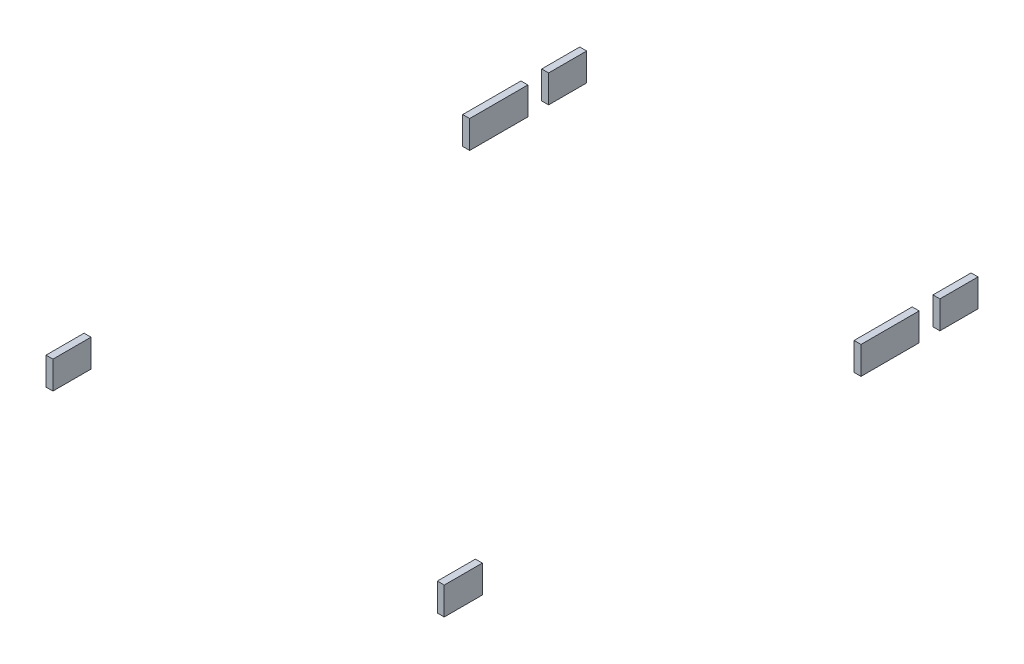
ISO-10303-21;
HEADER;
FILE_DESCRIPTION(('STEP AP214'),'2;1');
FILE_NAME('part.step','',(''),(''),'','','');
FILE_SCHEMA(('AUTOMOTIVE_DESIGN { 1 0 10303 214 1 1 1 1 }'));
ENDSEC;
DATA;
#1=APPLICATION_CONTEXT('core data for automotive mechanical design processes');
#2=APPLICATION_PROTOCOL_DEFINITION('international standard','automotive_design',2000,#1);
#3=PRODUCT_CONTEXT('',#1,'mechanical');
#4=PRODUCT('Part','Part','',(#3));
#5=PRODUCT_RELATED_PRODUCT_CATEGORY('part','',(#4));
#6=PRODUCT_DEFINITION_FORMATION('','',#4);
#7=PRODUCT_DEFINITION_CONTEXT('part definition',#1,'design');
#8=PRODUCT_DEFINITION('design','',#6,#7);
#9=PRODUCT_DEFINITION_SHAPE('','',#8);
#10=(LENGTH_UNIT() NAMED_UNIT(*) SI_UNIT(.MILLI.,.METRE.));
#11=(NAMED_UNIT(*) PLANE_ANGLE_UNIT() SI_UNIT($,.RADIAN.));
#12=(NAMED_UNIT(*) SI_UNIT($,.STERADIAN.) SOLID_ANGLE_UNIT());
#13=UNCERTAINTY_MEASURE_WITH_UNIT(LENGTH_MEASURE(1.E-05),#10,'distance_accuracy_value','');
#14=(GEOMETRIC_REPRESENTATION_CONTEXT(3) GLOBAL_UNCERTAINTY_ASSIGNED_CONTEXT((#13)) GLOBAL_UNIT_ASSIGNED_CONTEXT((#10,
#11,#12)) REPRESENTATION_CONTEXT('',''));
#15=CARTESIAN_POINT('',(0.,0.,0.));
#16=DIRECTION('',(0.,0.,1.));
#17=DIRECTION('',(1.,0.,0.));
#18=AXIS2_PLACEMENT_3D('',#15,#16,#17);
#19=CARTESIAN_POINT('',(-287.55,-400.,600.));
#20=DIRECTION('',(0.,0.,1.));
#21=DIRECTION('',(1.,0.,0.));
#22=AXIS2_PLACEMENT_3D('',#19,#20,#21);
#23=PLANE('',#22);
#24=DIRECTION('',(1.,0.,0.));
#25=VECTOR('',#24,1.);
#26=CARTESIAN_POINT('',(-287.55,-400.,600.));
#27=LINE('',#26,#25);
#28=CARTESIAN_POINT('',(-287.55,-400.,600.));
#29=VERTEX_POINT('',#28);
#30=CARTESIAN_POINT('',(-277.55,-400.,600.));
#31=VERTEX_POINT('',#30);
#32=EDGE_CURVE('P0_E10',#29,#31,#27,.T.);
#33=ORIENTED_EDGE('',*,*,#32,.T.);
#34=DIRECTION('',(0.,-1.,0.));
#35=VECTOR('',#34,1.);
#36=CARTESIAN_POINT('',(-277.55,-400.,600.));
#37=LINE('',#36,#35);
#38=CARTESIAN_POINT('',(-277.55,-440.,600.));
#39=VERTEX_POINT('',#38);
#40=EDGE_CURVE('P0_E25',#31,#39,#37,.T.);
#41=ORIENTED_EDGE('',*,*,#40,.T.);
#42=DIRECTION('',(1.,0.,0.));
#43=VECTOR('',#42,1.);
#44=CARTESIAN_POINT('',(-287.55,-440.,600.));
#45=LINE('',#44,#43);
#46=CARTESIAN_POINT('',(-287.55,-440.,600.));
#47=VERTEX_POINT('',#46);
#48=EDGE_CURVE('P0_E76',#47,#39,#45,.T.);
#49=ORIENTED_EDGE('',*,*,#48,.F.);
#50=DIRECTION('',(0.,-1.,0.));
#51=VECTOR('',#50,1.);
#52=CARTESIAN_POINT('',(-287.55,-400.,600.));
#53=LINE('',#52,#51);
#54=EDGE_CURVE('P0_E73',#29,#47,#53,.T.);
#55=ORIENTED_EDGE('',*,*,#54,.F.);
#56=EDGE_LOOP('',(#33,#41,#49,#55));
#57=FACE_BOUND('',#56,.T.);
#58=ADVANCED_FACE('P0_F15',(#57),#23,.F.);
#59=CARTESIAN_POINT('',(-277.55,-400.,600.));
#60=DIRECTION('',(-1.,0.,0.));
#61=DIRECTION('',(0.,0.,1.));
#62=AXIS2_PLACEMENT_3D('',#59,#60,#61);
#63=PLANE('',#62);
#64=DIRECTION('',(0.,0.,1.));
#65=VECTOR('',#64,1.);
#66=CARTESIAN_POINT('',(-277.55,-400.,600.));
#67=LINE('',#66,#65);
#68=CARTESIAN_POINT('',(-277.55,-400.,655.));
#69=VERTEX_POINT('',#68);
#70=EDGE_CURVE('P0_E81',#31,#69,#67,.T.);
#71=ORIENTED_EDGE('',*,*,#70,.T.);
#72=DIRECTION('',(0.,-1.,0.));
#73=VECTOR('',#72,1.);
#74=CARTESIAN_POINT('',(-277.55,-400.,655.));
#75=LINE('',#74,#73);
#76=CARTESIAN_POINT('',(-277.55,-440.,655.));
#77=VERTEX_POINT('',#76);
#78=EDGE_CURVE('P0_E83',#69,#77,#75,.T.);
#79=ORIENTED_EDGE('',*,*,#78,.T.);
#80=DIRECTION('',(0.,0.,1.));
#81=VECTOR('',#80,1.);
#82=CARTESIAN_POINT('',(-277.55,-440.,600.));
#83=LINE('',#82,#81);
#84=EDGE_CURVE('P0_E60',#39,#77,#83,.T.);
#85=ORIENTED_EDGE('',*,*,#84,.F.);
#86=ORIENTED_EDGE('',*,*,#40,.F.);
#87=EDGE_LOOP('',(#71,#79,#85,#86));
#88=FACE_BOUND('',#87,.T.);
#89=ADVANCED_FACE('P0_F86',(#88),#63,.F.);
#90=CARTESIAN_POINT('',(-277.55,-400.,655.));
#91=DIRECTION('',(0.,0.,-1.));
#92=DIRECTION('',(-1.,0.,0.));
#93=AXIS2_PLACEMENT_3D('',#90,#91,#92);
#94=PLANE('',#93);
#95=DIRECTION('',(-1.,0.,0.));
#96=VECTOR('',#95,1.);
#97=CARTESIAN_POINT('',(-277.55,-400.,655.));
#98=LINE('',#97,#96);
#99=CARTESIAN_POINT('',(-287.55,-400.,655.));
#100=VERTEX_POINT('',#99);
#101=EDGE_CURVE('P0_E66',#69,#100,#98,.T.);
#102=ORIENTED_EDGE('',*,*,#101,.T.);
#103=DIRECTION('',(0.,-1.,0.));
#104=VECTOR('',#103,1.);
#105=CARTESIAN_POINT('',(-287.55,-400.,655.));
#106=LINE('',#105,#104);
#107=CARTESIAN_POINT('',(-287.55,-440.,655.));
#108=VERTEX_POINT('',#107);
#109=EDGE_CURVE('P0_E53',#100,#108,#106,.T.);
#110=ORIENTED_EDGE('',*,*,#109,.T.);
#111=DIRECTION('',(-1.,0.,0.));
#112=VECTOR('',#111,1.);
#113=CARTESIAN_POINT('',(-277.55,-440.,655.));
#114=LINE('',#113,#112);
#115=EDGE_CURVE('P0_E59',#77,#108,#114,.T.);
#116=ORIENTED_EDGE('',*,*,#115,.F.);
#117=ORIENTED_EDGE('',*,*,#78,.F.);
#118=EDGE_LOOP('',(#102,#110,#116,#117));
#119=FACE_BOUND('',#118,.T.);
#120=ADVANCED_FACE('P0_F64',(#119),#94,.F.);
#121=CARTESIAN_POINT('',(-287.55,-400.,655.));
#122=DIRECTION('',(1.,0.,0.));
#123=DIRECTION('',(0.,0.,-1.));
#124=AXIS2_PLACEMENT_3D('',#121,#122,#123);
#125=PLANE('',#124);
#126=DIRECTION('',(0.,0.,-1.));
#127=VECTOR('',#126,1.);
#128=CARTESIAN_POINT('',(-287.55,-400.,655.));
#129=LINE('',#128,#127);
#130=EDGE_CURVE('P0_E68',#100,#29,#129,.T.);
#131=ORIENTED_EDGE('',*,*,#130,.T.);
#132=ORIENTED_EDGE('',*,*,#54,.T.);
#133=DIRECTION('',(0.,0.,-1.));
#134=VECTOR('',#133,1.);
#135=CARTESIAN_POINT('',(-287.55,-440.,655.));
#136=LINE('',#135,#134);
#137=EDGE_CURVE('P0_E19',#108,#47,#136,.T.);
#138=ORIENTED_EDGE('',*,*,#137,.F.);
#139=ORIENTED_EDGE('',*,*,#109,.F.);
#140=EDGE_LOOP('',(#131,#132,#138,#139));
#141=FACE_BOUND('',#140,.T.);
#142=ADVANCED_FACE('P0_F71',(#141),#125,.F.);
#143=CARTESIAN_POINT('',(1.085961E-11,-400.,876.96888276263));
#144=DIRECTION('',(0.,1.,0.));
#145=DIRECTION('',(0.,0.,1.));
#146=AXIS2_PLACEMENT_3D('',#143,#144,#145);
#147=PLANE('',#146);
#148=ORIENTED_EDGE('',*,*,#130,.F.);
#149=ORIENTED_EDGE('',*,*,#101,.F.);
#150=ORIENTED_EDGE('',*,*,#70,.F.);
#151=ORIENTED_EDGE('',*,*,#32,.F.);
#152=EDGE_LOOP('',(#148,#149,#150,#151));
#153=FACE_BOUND('',#152,.T.);
#154=ADVANCED_FACE('P0_F89',(#153),#147,.T.);
#155=CARTESIAN_POINT('',(1.086361E-11,-440.,876.96888276263));
#156=DIRECTION('',(0.,1.,0.));
#157=DIRECTION('',(0.,0.,1.));
#158=AXIS2_PLACEMENT_3D('',#155,#156,#157);
#159=PLANE('',#158);
#160=ORIENTED_EDGE('',*,*,#48,.T.);
#161=ORIENTED_EDGE('',*,*,#84,.T.);
#162=ORIENTED_EDGE('',*,*,#115,.T.);
#163=ORIENTED_EDGE('',*,*,#137,.T.);
#164=EDGE_LOOP('',(#160,#161,#162,#163));
#165=FACE_BOUND('',#164,.T.);
#166=ADVANCED_FACE('P0_F17',(#165),#159,.F.);
#167=CLOSED_SHELL('',(#58,#89,#120,#142,#154,#166));
#168=MANIFOLD_SOLID_BREP('P0_B1',#167);
#169=CARTESIAN_POINT('',(287.55,-400.,1370.8));
#170=DIRECTION('',(0.,0.,-1.));
#171=DIRECTION('',(-1.,0.,0.));
#172=AXIS2_PLACEMENT_3D('',#169,#170,#171);
#173=PLANE('',#172);
#174=DIRECTION('',(-1.,0.,0.));
#175=VECTOR('',#174,1.);
#176=CARTESIAN_POINT('',(287.55,-400.,1370.8));
#177=LINE('',#176,#175);
#178=CARTESIAN_POINT('',(287.55,-400.,1370.8));
#179=VERTEX_POINT('',#178);
#180=CARTESIAN_POINT('',(277.55,-400.,1370.8));
#181=VERTEX_POINT('',#180);
#182=EDGE_CURVE('P1_E11',#179,#181,#177,.T.);
#183=ORIENTED_EDGE('',*,*,#182,.T.);
#184=DIRECTION('',(0.,-1.,0.));
#185=VECTOR('',#184,1.);
#186=CARTESIAN_POINT('',(277.55,-400.,1370.8));
#187=LINE('',#186,#185);
#188=CARTESIAN_POINT('',(277.55,-440.,1370.8));
#189=VERTEX_POINT('',#188);
#190=EDGE_CURVE('P1_E26',#181,#189,#187,.T.);
#191=ORIENTED_EDGE('',*,*,#190,.T.);
#192=DIRECTION('',(-1.,0.,0.));
#193=VECTOR('',#192,1.);
#194=CARTESIAN_POINT('',(287.55,-440.,1370.8));
#195=LINE('',#194,#193);
#196=CARTESIAN_POINT('',(287.55,-440.,1370.8));
#197=VERTEX_POINT('',#196);
#198=EDGE_CURVE('P1_E77',#197,#189,#195,.T.);
#199=ORIENTED_EDGE('',*,*,#198,.F.);
#200=DIRECTION('',(0.,-1.,0.));
#201=VECTOR('',#200,1.);
#202=CARTESIAN_POINT('',(287.55,-400.,1370.8));
#203=LINE('',#202,#201);
#204=EDGE_CURVE('P1_E74',#179,#197,#203,.T.);
#205=ORIENTED_EDGE('',*,*,#204,.F.);
#206=EDGE_LOOP('',(#183,#191,#199,#205));
#207=FACE_BOUND('',#206,.T.);
#208=ADVANCED_FACE('P1_F16',(#207),#173,.F.);
#209=CARTESIAN_POINT('',(277.55,-400.,1370.8));
#210=DIRECTION('',(1.,0.,0.));
#211=DIRECTION('',(0.,0.,-1.));
#212=AXIS2_PLACEMENT_3D('',#209,#210,#211);
#213=PLANE('',#212);
#214=DIRECTION('',(0.,0.,-1.));
#215=VECTOR('',#214,1.);
#216=CARTESIAN_POINT('',(277.55,-400.,1370.8));
#217=LINE('',#216,#215);
#218=CARTESIAN_POINT('',(277.55,-400.,1315.8));
#219=VERTEX_POINT('',#218);
#220=EDGE_CURVE('P1_E82',#181,#219,#217,.T.);
#221=ORIENTED_EDGE('',*,*,#220,.T.);
#222=DIRECTION('',(0.,-1.,0.));
#223=VECTOR('',#222,1.);
#224=CARTESIAN_POINT('',(277.55,-400.,1315.8));
#225=LINE('',#224,#223);
#226=CARTESIAN_POINT('',(277.55,-440.,1315.8));
#227=VERTEX_POINT('',#226);
#228=EDGE_CURVE('P1_E84',#219,#227,#225,.T.);
#229=ORIENTED_EDGE('',*,*,#228,.T.);
#230=DIRECTION('',(0.,0.,-1.));
#231=VECTOR('',#230,1.);
#232=CARTESIAN_POINT('',(277.55,-440.,1370.8));
#233=LINE('',#232,#231);
#234=EDGE_CURVE('P1_E61',#189,#227,#233,.T.);
#235=ORIENTED_EDGE('',*,*,#234,.F.);
#236=ORIENTED_EDGE('',*,*,#190,.F.);
#237=EDGE_LOOP('',(#221,#229,#235,#236));
#238=FACE_BOUND('',#237,.T.);
#239=ADVANCED_FACE('P1_F87',(#238),#213,.F.);
#240=CARTESIAN_POINT('',(277.55,-400.,1315.8));
#241=DIRECTION('',(0.,0.,1.));
#242=DIRECTION('',(1.,0.,0.));
#243=AXIS2_PLACEMENT_3D('',#240,#241,#242);
#244=PLANE('',#243);
#245=DIRECTION('',(1.,0.,0.));
#246=VECTOR('',#245,1.);
#247=CARTESIAN_POINT('',(277.55,-400.,1315.8));
#248=LINE('',#247,#246);
#249=CARTESIAN_POINT('',(287.55,-400.,1315.8));
#250=VERTEX_POINT('',#249);
#251=EDGE_CURVE('P1_E67',#219,#250,#248,.T.);
#252=ORIENTED_EDGE('',*,*,#251,.T.);
#253=DIRECTION('',(0.,-1.,0.));
#254=VECTOR('',#253,1.);
#255=CARTESIAN_POINT('',(287.55,-400.,1315.8));
#256=LINE('',#255,#254);
#257=CARTESIAN_POINT('',(287.55,-440.,1315.8));
#258=VERTEX_POINT('',#257);
#259=EDGE_CURVE('P1_E54',#250,#258,#256,.T.);
#260=ORIENTED_EDGE('',*,*,#259,.T.);
#261=DIRECTION('',(1.,0.,0.));
#262=VECTOR('',#261,1.);
#263=CARTESIAN_POINT('',(277.55,-440.,1315.8));
#264=LINE('',#263,#262);
#265=EDGE_CURVE('P1_E60',#227,#258,#264,.T.);
#266=ORIENTED_EDGE('',*,*,#265,.F.);
#267=ORIENTED_EDGE('',*,*,#228,.F.);
#268=EDGE_LOOP('',(#252,#260,#266,#267));
#269=FACE_BOUND('',#268,.T.);
#270=ADVANCED_FACE('P1_F65',(#269),#244,.F.);
#271=CARTESIAN_POINT('',(287.55,-400.,1315.8));
#272=DIRECTION('',(-1.,0.,0.));
#273=DIRECTION('',(0.,0.,1.));
#274=AXIS2_PLACEMENT_3D('',#271,#272,#273);
#275=PLANE('',#274);
#276=DIRECTION('',(0.,0.,1.));
#277=VECTOR('',#276,1.);
#278=CARTESIAN_POINT('',(287.55,-400.,1315.8));
#279=LINE('',#278,#277);
#280=EDGE_CURVE('P1_E69',#250,#179,#279,.T.);
#281=ORIENTED_EDGE('',*,*,#280,.T.);
#282=ORIENTED_EDGE('',*,*,#204,.T.);
#283=DIRECTION('',(0.,0.,1.));
#284=VECTOR('',#283,1.);
#285=CARTESIAN_POINT('',(287.55,-440.,1315.8));
#286=LINE('',#285,#284);
#287=EDGE_CURVE('P1_E20',#258,#197,#286,.T.);
#288=ORIENTED_EDGE('',*,*,#287,.F.);
#289=ORIENTED_EDGE('',*,*,#259,.F.);
#290=EDGE_LOOP('',(#281,#282,#288,#289));
#291=FACE_BOUND('',#290,.T.);
#292=ADVANCED_FACE('P1_F72',(#291),#275,.F.);
#293=CARTESIAN_POINT('',(1.085961E-11,-400.,876.96888276263));
#294=DIRECTION('',(0.,1.,0.));
#295=DIRECTION('',(0.,0.,1.));
#296=AXIS2_PLACEMENT_3D('',#293,#294,#295);
#297=PLANE('',#296);
#298=ORIENTED_EDGE('',*,*,#280,.F.);
#299=ORIENTED_EDGE('',*,*,#251,.F.);
#300=ORIENTED_EDGE('',*,*,#220,.F.);
#301=ORIENTED_EDGE('',*,*,#182,.F.);
#302=EDGE_LOOP('',(#298,#299,#300,#301));
#303=FACE_BOUND('',#302,.T.);
#304=ADVANCED_FACE('P1_F90',(#303),#297,.T.);
#305=CARTESIAN_POINT('',(1.086361E-11,-440.,876.96888276263));
#306=DIRECTION('',(0.,1.,0.));
#307=DIRECTION('',(0.,0.,1.));
#308=AXIS2_PLACEMENT_3D('',#305,#306,#307);
#309=PLANE('',#308);
#310=ORIENTED_EDGE('',*,*,#198,.T.);
#311=ORIENTED_EDGE('',*,*,#234,.T.);
#312=ORIENTED_EDGE('',*,*,#265,.T.);
#313=ORIENTED_EDGE('',*,*,#287,.T.);
#314=EDGE_LOOP('',(#310,#311,#312,#313));
#315=FACE_BOUND('',#314,.T.);
#316=ADVANCED_FACE('P1_F18',(#315),#309,.F.);
#317=CLOSED_SHELL('',(#208,#239,#270,#292,#304,#316));
#318=MANIFOLD_SOLID_BREP('P1_B1',#317);
#319=CARTESIAN_POINT('',(-287.55,-400.,768.98999999997));
#320=DIRECTION('',(0.,0.,1.));
#321=DIRECTION('',(1.,0.,0.));
#322=AXIS2_PLACEMENT_3D('',#319,#320,#321);
#323=PLANE('',#322);
#324=DIRECTION('',(0.,-1.,0.));
#325=VECTOR('',#324,1.);
#326=CARTESIAN_POINT('',(-287.55,-400.,768.98999999997));
#327=LINE('',#326,#325);
#328=CARTESIAN_POINT('',(-287.55,-400.,768.98999999997));
#329=VERTEX_POINT('',#328);
#330=CARTESIAN_POINT('',(-287.55,-440.,768.98999999997));
#331=VERTEX_POINT('',#330);
#332=EDGE_CURVE('P2_E11',#329,#331,#327,.T.);
#333=ORIENTED_EDGE('',*,*,#332,.T.);
#334=DIRECTION('',(1.,0.,0.));
#335=VECTOR('',#334,1.);
#336=CARTESIAN_POINT('',(-287.55,-440.,768.98999999997));
#337=LINE('',#336,#335);
#338=CARTESIAN_POINT('',(-277.55,-440.,768.98999999997));
#339=VERTEX_POINT('',#338);
#340=EDGE_CURVE('P2_E26',#331,#339,#337,.T.);
#341=ORIENTED_EDGE('',*,*,#340,.T.);
#342=DIRECTION('',(0.,-1.,0.));
#343=VECTOR('',#342,1.);
#344=CARTESIAN_POINT('',(-277.55,-400.,768.98999999997));
#345=LINE('',#344,#343);
#346=CARTESIAN_POINT('',(-277.55,-400.,768.98999999997));
#347=VERTEX_POINT('',#346);
#348=EDGE_CURVE('P2_E78',#347,#339,#345,.T.);
#349=ORIENTED_EDGE('',*,*,#348,.F.);
#350=DIRECTION('',(1.,0.,0.));
#351=VECTOR('',#350,1.);
#352=CARTESIAN_POINT('',(-287.55,-400.,768.98999999997));
#353=LINE('',#352,#351);
#354=EDGE_CURVE('P2_E77',#329,#347,#353,.T.);
#355=ORIENTED_EDGE('',*,*,#354,.F.);
#356=EDGE_LOOP('',(#333,#341,#349,#355));
#357=FACE_BOUND('',#356,.T.);
#358=ADVANCED_FACE('P2_F16',(#357),#323,.T.);
#359=CARTESIAN_POINT('',(-277.55,-400.,768.98999999997));
#360=DIRECTION('',(1.,0.,0.));
#361=DIRECTION('',(0.,0.,-1.));
#362=AXIS2_PLACEMENT_3D('',#359,#360,#361);
#363=PLANE('',#362);
#364=ORIENTED_EDGE('',*,*,#348,.T.);
#365=DIRECTION('',(0.,0.,-1.));
#366=VECTOR('',#365,1.);
#367=CARTESIAN_POINT('',(-277.55,-440.,768.98999999997));
#368=LINE('',#367,#366);
#369=CARTESIAN_POINT('',(-277.55,-440.,685.));
#370=VERTEX_POINT('',#369);
#371=EDGE_CURVE('P2_E84',#339,#370,#368,.T.);
#372=ORIENTED_EDGE('',*,*,#371,.T.);
#373=DIRECTION('',(0.,-1.,0.));
#374=VECTOR('',#373,1.);
#375=CARTESIAN_POINT('',(-277.55,-400.,685.));
#376=LINE('',#375,#374);
#377=CARTESIAN_POINT('',(-277.55,-400.,685.));
#378=VERTEX_POINT('',#377);
#379=EDGE_CURVE('P2_E87',#378,#370,#376,.T.);
#380=ORIENTED_EDGE('',*,*,#379,.F.);
#381=DIRECTION('',(0.,0.,-1.));
#382=VECTOR('',#381,1.);
#383=CARTESIAN_POINT('',(-277.55,-400.,768.98999999997));
#384=LINE('',#383,#382);
#385=EDGE_CURVE('P2_E63',#347,#378,#384,.T.);
#386=ORIENTED_EDGE('',*,*,#385,.F.);
#387=EDGE_LOOP('',(#364,#372,#380,#386));
#388=FACE_BOUND('',#387,.T.);
#389=ADVANCED_FACE('P2_F90',(#388),#363,.T.);
#390=CARTESIAN_POINT('',(-277.55,-400.,685.));
#391=DIRECTION('',(0.,0.,-1.));
#392=DIRECTION('',(-1.,0.,0.));
#393=AXIS2_PLACEMENT_3D('',#390,#391,#392);
#394=PLANE('',#393);
#395=ORIENTED_EDGE('',*,*,#379,.T.);
#396=DIRECTION('',(-1.,0.,0.));
#397=VECTOR('',#396,1.);
#398=CARTESIAN_POINT('',(-277.55,-440.,685.));
#399=LINE('',#398,#397);
#400=CARTESIAN_POINT('',(-287.55,-440.,685.));
#401=VERTEX_POINT('',#400);
#402=EDGE_CURVE('P2_E69',#370,#401,#399,.T.);
#403=ORIENTED_EDGE('',*,*,#402,.T.);
#404=DIRECTION('',(0.,-1.,0.));
#405=VECTOR('',#404,1.);
#406=CARTESIAN_POINT('',(-287.55,-400.,685.));
#407=LINE('',#406,#405);
#408=CARTESIAN_POINT('',(-287.55,-400.,685.));
#409=VERTEX_POINT('',#408);
#410=EDGE_CURVE('P2_E54',#409,#401,#407,.T.);
#411=ORIENTED_EDGE('',*,*,#410,.F.);
#412=DIRECTION('',(-1.,0.,0.));
#413=VECTOR('',#412,1.);
#414=CARTESIAN_POINT('',(-277.55,-400.,685.));
#415=LINE('',#414,#413);
#416=EDGE_CURVE('P2_E60',#378,#409,#415,.T.);
#417=ORIENTED_EDGE('',*,*,#416,.F.);
#418=EDGE_LOOP('',(#395,#403,#411,#417));
#419=FACE_BOUND('',#418,.T.);
#420=ADVANCED_FACE('P2_F67',(#419),#394,.T.);
#421=CARTESIAN_POINT('',(-287.55,-400.,685.));
#422=DIRECTION('',(-1.,0.,0.));
#423=DIRECTION('',(0.,0.,1.));
#424=AXIS2_PLACEMENT_3D('',#421,#422,#423);
#425=PLANE('',#424);
#426=ORIENTED_EDGE('',*,*,#410,.T.);
#427=DIRECTION('',(0.,0.,1.));
#428=VECTOR('',#427,1.);
#429=CARTESIAN_POINT('',(-287.55,-440.,685.));
#430=LINE('',#429,#428);
#431=EDGE_CURVE('P2_E70',#401,#331,#430,.T.);
#432=ORIENTED_EDGE('',*,*,#431,.T.);
#433=ORIENTED_EDGE('',*,*,#332,.F.);
#434=DIRECTION('',(0.,0.,1.));
#435=VECTOR('',#434,1.);
#436=CARTESIAN_POINT('',(-287.55,-400.,685.));
#437=LINE('',#436,#435);
#438=EDGE_CURVE('P2_E20',#409,#329,#437,.T.);
#439=ORIENTED_EDGE('',*,*,#438,.F.);
#440=EDGE_LOOP('',(#426,#432,#433,#439));
#441=FACE_BOUND('',#440,.T.);
#442=ADVANCED_FACE('P2_F73',(#441),#425,.T.);
#443=CARTESIAN_POINT('',(1.085961E-11,-400.,876.96888276263));
#444=DIRECTION('',(0.,1.,0.));
#445=DIRECTION('',(0.,0.,1.));
#446=AXIS2_PLACEMENT_3D('',#443,#444,#445);
#447=PLANE('',#446);
#448=ORIENTED_EDGE('',*,*,#354,.T.);
#449=ORIENTED_EDGE('',*,*,#385,.T.);
#450=ORIENTED_EDGE('',*,*,#416,.T.);
#451=ORIENTED_EDGE('',*,*,#438,.T.);
#452=EDGE_LOOP('',(#448,#449,#450,#451));
#453=FACE_BOUND('',#452,.T.);
#454=ADVANCED_FACE('P2_F61',(#453),#447,.T.);
#455=CARTESIAN_POINT('',(1.086361E-11,-440.,876.96888276263));
#456=DIRECTION('',(0.,1.,0.));
#457=DIRECTION('',(0.,0.,1.));
#458=AXIS2_PLACEMENT_3D('',#455,#456,#457);
#459=PLANE('',#458);
#460=ORIENTED_EDGE('',*,*,#431,.F.);
#461=ORIENTED_EDGE('',*,*,#402,.F.);
#462=ORIENTED_EDGE('',*,*,#371,.F.);
#463=ORIENTED_EDGE('',*,*,#340,.F.);
#464=EDGE_LOOP('',(#460,#461,#462,#463));
#465=FACE_BOUND('',#464,.T.);
#466=ADVANCED_FACE('P2_F18',(#465),#459,.F.);
#467=CLOSED_SHELL('',(#358,#389,#420,#442,#454,#466));
#468=MANIFOLD_SOLID_BREP('P2_B1',#467);
#469=CARTESIAN_POINT('',(287.55,-400.,600.));
#470=DIRECTION('',(0.,0.,-1.));
#471=DIRECTION('',(-1.,0.,0.));
#472=AXIS2_PLACEMENT_3D('',#469,#470,#471);
#473=PLANE('',#472);
#474=DIRECTION('',(0.,-1.,0.));
#475=VECTOR('',#474,1.);
#476=CARTESIAN_POINT('',(287.55,-400.,600.));
#477=LINE('',#476,#475);
#478=CARTESIAN_POINT('',(287.55,-400.,600.));
#479=VERTEX_POINT('',#478);
#480=CARTESIAN_POINT('',(287.55,-440.,600.));
#481=VERTEX_POINT('',#480);
#482=EDGE_CURVE('P3_E11',#479,#481,#477,.T.);
#483=ORIENTED_EDGE('',*,*,#482,.T.);
#484=DIRECTION('',(-1.,0.,0.));
#485=VECTOR('',#484,1.);
#486=CARTESIAN_POINT('',(287.55,-440.,600.));
#487=LINE('',#486,#485);
#488=CARTESIAN_POINT('',(277.55,-440.,600.));
#489=VERTEX_POINT('',#488);
#490=EDGE_CURVE('P3_E26',#481,#489,#487,.T.);
#491=ORIENTED_EDGE('',*,*,#490,.T.);
#492=DIRECTION('',(0.,-1.,0.));
#493=VECTOR('',#492,1.);
#494=CARTESIAN_POINT('',(277.55,-400.,600.));
#495=LINE('',#494,#493);
#496=CARTESIAN_POINT('',(277.55,-400.,600.));
#497=VERTEX_POINT('',#496);
#498=EDGE_CURVE('P3_E78',#497,#489,#495,.T.);
#499=ORIENTED_EDGE('',*,*,#498,.F.);
#500=DIRECTION('',(-1.,0.,0.));
#501=VECTOR('',#500,1.);
#502=CARTESIAN_POINT('',(287.55,-400.,600.));
#503=LINE('',#502,#501);
#504=EDGE_CURVE('P3_E77',#479,#497,#503,.T.);
#505=ORIENTED_EDGE('',*,*,#504,.F.);
#506=EDGE_LOOP('',(#483,#491,#499,#505));
#507=FACE_BOUND('',#506,.T.);
#508=ADVANCED_FACE('P3_F16',(#507),#473,.T.);
#509=CARTESIAN_POINT('',(277.55,-400.,600.));
#510=DIRECTION('',(-1.,0.,0.));
#511=DIRECTION('',(0.,0.,1.));
#512=AXIS2_PLACEMENT_3D('',#509,#510,#511);
#513=PLANE('',#512);
#514=ORIENTED_EDGE('',*,*,#498,.T.);
#515=DIRECTION('',(0.,0.,1.));
#516=VECTOR('',#515,1.);
#517=CARTESIAN_POINT('',(277.55,-440.,600.));
#518=LINE('',#517,#516);
#519=CARTESIAN_POINT('',(277.55,-440.,655.));
#520=VERTEX_POINT('',#519);
#521=EDGE_CURVE('P3_E84',#489,#520,#518,.T.);
#522=ORIENTED_EDGE('',*,*,#521,.T.);
#523=DIRECTION('',(0.,-1.,0.));
#524=VECTOR('',#523,1.);
#525=CARTESIAN_POINT('',(277.55,-400.,655.));
#526=LINE('',#525,#524);
#527=CARTESIAN_POINT('',(277.55,-400.,655.));
#528=VERTEX_POINT('',#527);
#529=EDGE_CURVE('P3_E87',#528,#520,#526,.T.);
#530=ORIENTED_EDGE('',*,*,#529,.F.);
#531=DIRECTION('',(0.,0.,1.));
#532=VECTOR('',#531,1.);
#533=CARTESIAN_POINT('',(277.55,-400.,600.));
#534=LINE('',#533,#532);
#535=EDGE_CURVE('P3_E63',#497,#528,#534,.T.);
#536=ORIENTED_EDGE('',*,*,#535,.F.);
#537=EDGE_LOOP('',(#514,#522,#530,#536));
#538=FACE_BOUND('',#537,.T.);
#539=ADVANCED_FACE('P3_F90',(#538),#513,.T.);
#540=CARTESIAN_POINT('',(277.55,-400.,655.));
#541=DIRECTION('',(0.,0.,1.));
#542=DIRECTION('',(1.,0.,0.));
#543=AXIS2_PLACEMENT_3D('',#540,#541,#542);
#544=PLANE('',#543);
#545=ORIENTED_EDGE('',*,*,#529,.T.);
#546=DIRECTION('',(1.,0.,0.));
#547=VECTOR('',#546,1.);
#548=CARTESIAN_POINT('',(277.55,-440.,655.));
#549=LINE('',#548,#547);
#550=CARTESIAN_POINT('',(287.55,-440.,655.));
#551=VERTEX_POINT('',#550);
#552=EDGE_CURVE('P3_E69',#520,#551,#549,.T.);
#553=ORIENTED_EDGE('',*,*,#552,.T.);
#554=DIRECTION('',(0.,-1.,0.));
#555=VECTOR('',#554,1.);
#556=CARTESIAN_POINT('',(287.55,-400.,655.));
#557=LINE('',#556,#555);
#558=CARTESIAN_POINT('',(287.55,-400.,655.));
#559=VERTEX_POINT('',#558);
#560=EDGE_CURVE('P3_E54',#559,#551,#557,.T.);
#561=ORIENTED_EDGE('',*,*,#560,.F.);
#562=DIRECTION('',(1.,0.,0.));
#563=VECTOR('',#562,1.);
#564=CARTESIAN_POINT('',(277.55,-400.,655.));
#565=LINE('',#564,#563);
#566=EDGE_CURVE('P3_E60',#528,#559,#565,.T.);
#567=ORIENTED_EDGE('',*,*,#566,.F.);
#568=EDGE_LOOP('',(#545,#553,#561,#567));
#569=FACE_BOUND('',#568,.T.);
#570=ADVANCED_FACE('P3_F67',(#569),#544,.T.);
#571=CARTESIAN_POINT('',(287.55,-400.,655.));
#572=DIRECTION('',(1.,0.,0.));
#573=DIRECTION('',(0.,0.,-1.));
#574=AXIS2_PLACEMENT_3D('',#571,#572,#573);
#575=PLANE('',#574);
#576=ORIENTED_EDGE('',*,*,#560,.T.);
#577=DIRECTION('',(0.,0.,-1.));
#578=VECTOR('',#577,1.);
#579=CARTESIAN_POINT('',(287.55,-440.,655.));
#580=LINE('',#579,#578);
#581=EDGE_CURVE('P3_E70',#551,#481,#580,.T.);
#582=ORIENTED_EDGE('',*,*,#581,.T.);
#583=ORIENTED_EDGE('',*,*,#482,.F.);
#584=DIRECTION('',(0.,0.,-1.));
#585=VECTOR('',#584,1.);
#586=CARTESIAN_POINT('',(287.55,-400.,655.));
#587=LINE('',#586,#585);
#588=EDGE_CURVE('P3_E20',#559,#479,#587,.T.);
#589=ORIENTED_EDGE('',*,*,#588,.F.);
#590=EDGE_LOOP('',(#576,#582,#583,#589));
#591=FACE_BOUND('',#590,.T.);
#592=ADVANCED_FACE('P3_F73',(#591),#575,.T.);
#593=CARTESIAN_POINT('',(1.085961E-11,-400.,876.96888276263));
#594=DIRECTION('',(0.,1.,0.));
#595=DIRECTION('',(0.,0.,1.));
#596=AXIS2_PLACEMENT_3D('',#593,#594,#595);
#597=PLANE('',#596);
#598=ORIENTED_EDGE('',*,*,#504,.T.);
#599=ORIENTED_EDGE('',*,*,#535,.T.);
#600=ORIENTED_EDGE('',*,*,#566,.T.);
#601=ORIENTED_EDGE('',*,*,#588,.T.);
#602=EDGE_LOOP('',(#598,#599,#600,#601));
#603=FACE_BOUND('',#602,.T.);
#604=ADVANCED_FACE('P3_F61',(#603),#597,.T.);
#605=CARTESIAN_POINT('',(1.086361E-11,-440.,876.96888276263));
#606=DIRECTION('',(0.,1.,0.));
#607=DIRECTION('',(0.,0.,1.));
#608=AXIS2_PLACEMENT_3D('',#605,#606,#607);
#609=PLANE('',#608);
#610=ORIENTED_EDGE('',*,*,#581,.F.);
#611=ORIENTED_EDGE('',*,*,#552,.F.);
#612=ORIENTED_EDGE('',*,*,#521,.F.);
#613=ORIENTED_EDGE('',*,*,#490,.F.);
#614=EDGE_LOOP('',(#610,#611,#612,#613));
#615=FACE_BOUND('',#614,.T.);
#616=ADVANCED_FACE('P3_F18',(#615),#609,.F.);
#617=CLOSED_SHELL('',(#508,#539,#570,#592,#604,#616));
#618=MANIFOLD_SOLID_BREP('P3_B1',#617);
#619=CARTESIAN_POINT('',(287.55,-400.,768.98999999999));
#620=DIRECTION('',(0.,0.,-1.));
#621=DIRECTION('',(-1.,0.,0.));
#622=AXIS2_PLACEMENT_3D('',#619,#620,#621);
#623=PLANE('',#622);
#624=DIRECTION('',(-1.,0.,0.));
#625=VECTOR('',#624,1.);
#626=CARTESIAN_POINT('',(287.55,-400.,768.98999999999));
#627=LINE('',#626,#625);
#628=CARTESIAN_POINT('',(287.55,-400.,768.98999999999));
#629=VERTEX_POINT('',#628);
#630=CARTESIAN_POINT('',(277.55,-400.,768.98999999999));
#631=VERTEX_POINT('',#630);
#632=EDGE_CURVE('P4_E11',#629,#631,#627,.T.);
#633=ORIENTED_EDGE('',*,*,#632,.T.);
#634=DIRECTION('',(0.,-1.,0.));
#635=VECTOR('',#634,1.);
#636=CARTESIAN_POINT('',(277.55,-400.,768.98999999999));
#637=LINE('',#636,#635);
#638=CARTESIAN_POINT('',(277.55,-440.,768.98999999999));
#639=VERTEX_POINT('',#638);
#640=EDGE_CURVE('P4_E26',#631,#639,#637,.T.);
#641=ORIENTED_EDGE('',*,*,#640,.T.);
#642=DIRECTION('',(-1.,0.,0.));
#643=VECTOR('',#642,1.);
#644=CARTESIAN_POINT('',(287.55,-440.,768.98999999999));
#645=LINE('',#644,#643);
#646=CARTESIAN_POINT('',(287.55,-440.,768.98999999999));
#647=VERTEX_POINT('',#646);
#648=EDGE_CURVE('P4_E77',#647,#639,#645,.T.);
#649=ORIENTED_EDGE('',*,*,#648,.F.);
#650=DIRECTION('',(0.,-1.,0.));
#651=VECTOR('',#650,1.);
#652=CARTESIAN_POINT('',(287.55,-400.,768.98999999999));
#653=LINE('',#652,#651);
#654=EDGE_CURVE('P4_E74',#629,#647,#653,.T.);
#655=ORIENTED_EDGE('',*,*,#654,.F.);
#656=EDGE_LOOP('',(#633,#641,#649,#655));
#657=FACE_BOUND('',#656,.T.);
#658=ADVANCED_FACE('P4_F16',(#657),#623,.F.);
#659=CARTESIAN_POINT('',(277.55,-400.,768.98999999999));
#660=DIRECTION('',(1.,0.,0.));
#661=DIRECTION('',(0.,0.,-1.));
#662=AXIS2_PLACEMENT_3D('',#659,#660,#661);
#663=PLANE('',#662);
#664=DIRECTION('',(0.,0.,-1.));
#665=VECTOR('',#664,1.);
#666=CARTESIAN_POINT('',(277.55,-400.,768.98999999999));
#667=LINE('',#666,#665);
#668=CARTESIAN_POINT('',(277.55,-400.,685.));
#669=VERTEX_POINT('',#668);
#670=EDGE_CURVE('P4_E82',#631,#669,#667,.T.);
#671=ORIENTED_EDGE('',*,*,#670,.T.);
#672=DIRECTION('',(0.,-1.,0.));
#673=VECTOR('',#672,1.);
#674=CARTESIAN_POINT('',(277.55,-400.,685.));
#675=LINE('',#674,#673);
#676=CARTESIAN_POINT('',(277.55,-440.,685.));
#677=VERTEX_POINT('',#676);
#678=EDGE_CURVE('P4_E84',#669,#677,#675,.T.);
#679=ORIENTED_EDGE('',*,*,#678,.T.);
#680=DIRECTION('',(0.,0.,-1.));
#681=VECTOR('',#680,1.);
#682=CARTESIAN_POINT('',(277.55,-440.,768.98999999999));
#683=LINE('',#682,#681);
#684=EDGE_CURVE('P4_E61',#639,#677,#683,.T.);
#685=ORIENTED_EDGE('',*,*,#684,.F.);
#686=ORIENTED_EDGE('',*,*,#640,.F.);
#687=EDGE_LOOP('',(#671,#679,#685,#686));
#688=FACE_BOUND('',#687,.T.);
#689=ADVANCED_FACE('P4_F87',(#688),#663,.F.);
#690=CARTESIAN_POINT('',(277.55,-400.,685.));
#691=DIRECTION('',(0.,0.,1.));
#692=DIRECTION('',(1.,0.,0.));
#693=AXIS2_PLACEMENT_3D('',#690,#691,#692);
#694=PLANE('',#693);
#695=DIRECTION('',(1.,0.,0.));
#696=VECTOR('',#695,1.);
#697=CARTESIAN_POINT('',(277.55,-400.,685.));
#698=LINE('',#697,#696);
#699=CARTESIAN_POINT('',(287.55,-400.,685.));
#700=VERTEX_POINT('',#699);
#701=EDGE_CURVE('P4_E67',#669,#700,#698,.T.);
#702=ORIENTED_EDGE('',*,*,#701,.T.);
#703=DIRECTION('',(0.,-1.,0.));
#704=VECTOR('',#703,1.);
#705=CARTESIAN_POINT('',(287.55,-400.,685.));
#706=LINE('',#705,#704);
#707=CARTESIAN_POINT('',(287.55,-440.,685.));
#708=VERTEX_POINT('',#707);
#709=EDGE_CURVE('P4_E54',#700,#708,#706,.T.);
#710=ORIENTED_EDGE('',*,*,#709,.T.);
#711=DIRECTION('',(1.,0.,0.));
#712=VECTOR('',#711,1.);
#713=CARTESIAN_POINT('',(277.55,-440.,685.));
#714=LINE('',#713,#712);
#715=EDGE_CURVE('P4_E60',#677,#708,#714,.T.);
#716=ORIENTED_EDGE('',*,*,#715,.F.);
#717=ORIENTED_EDGE('',*,*,#678,.F.);
#718=EDGE_LOOP('',(#702,#710,#716,#717));
#719=FACE_BOUND('',#718,.T.);
#720=ADVANCED_FACE('P4_F65',(#719),#694,.F.);
#721=CARTESIAN_POINT('',(287.55,-400.,685.));
#722=DIRECTION('',(-1.,0.,0.));
#723=DIRECTION('',(0.,0.,1.));
#724=AXIS2_PLACEMENT_3D('',#721,#722,#723);
#725=PLANE('',#724);
#726=DIRECTION('',(0.,0.,1.));
#727=VECTOR('',#726,1.);
#728=CARTESIAN_POINT('',(287.55,-400.,685.));
#729=LINE('',#728,#727);
#730=EDGE_CURVE('P4_E69',#700,#629,#729,.T.);
#731=ORIENTED_EDGE('',*,*,#730,.T.);
#732=ORIENTED_EDGE('',*,*,#654,.T.);
#733=DIRECTION('',(0.,0.,1.));
#734=VECTOR('',#733,1.);
#735=CARTESIAN_POINT('',(287.55,-440.,685.));
#736=LINE('',#735,#734);
#737=EDGE_CURVE('P4_E20',#708,#647,#736,.T.);
#738=ORIENTED_EDGE('',*,*,#737,.F.);
#739=ORIENTED_EDGE('',*,*,#709,.F.);
#740=EDGE_LOOP('',(#731,#732,#738,#739));
#741=FACE_BOUND('',#740,.T.);
#742=ADVANCED_FACE('P4_F72',(#741),#725,.F.);
#743=CARTESIAN_POINT('',(1.085961E-11,-400.,876.96888276263));
#744=DIRECTION('',(0.,1.,0.));
#745=DIRECTION('',(0.,0.,1.));
#746=AXIS2_PLACEMENT_3D('',#743,#744,#745);
#747=PLANE('',#746);
#748=ORIENTED_EDGE('',*,*,#730,.F.);
#749=ORIENTED_EDGE('',*,*,#701,.F.);
#750=ORIENTED_EDGE('',*,*,#670,.F.);
#751=ORIENTED_EDGE('',*,*,#632,.F.);
#752=EDGE_LOOP('',(#748,#749,#750,#751));
#753=FACE_BOUND('',#752,.T.);
#754=ADVANCED_FACE('P4_F90',(#753),#747,.T.);
#755=CARTESIAN_POINT('',(1.086361E-11,-440.,876.96888276263));
#756=DIRECTION('',(0.,1.,0.));
#757=DIRECTION('',(0.,0.,1.));
#758=AXIS2_PLACEMENT_3D('',#755,#756,#757);
#759=PLANE('',#758);
#760=ORIENTED_EDGE('',*,*,#648,.T.);
#761=ORIENTED_EDGE('',*,*,#684,.T.);
#762=ORIENTED_EDGE('',*,*,#715,.T.);
#763=ORIENTED_EDGE('',*,*,#737,.T.);
#764=EDGE_LOOP('',(#760,#761,#762,#763));
#765=FACE_BOUND('',#764,.T.);
#766=ADVANCED_FACE('P4_F18',(#765),#759,.F.);
#767=CLOSED_SHELL('',(#658,#689,#720,#742,#754,#766));
#768=MANIFOLD_SOLID_BREP('P4_B1',#767);
#769=CARTESIAN_POINT('',(-287.55,-400.,1370.8));
#770=DIRECTION('',(0.,0.,1.));
#771=DIRECTION('',(1.,0.,0.));
#772=AXIS2_PLACEMENT_3D('',#769,#770,#771);
#773=PLANE('',#772);
#774=DIRECTION('',(0.,-1.,0.));
#775=VECTOR('',#774,1.);
#776=CARTESIAN_POINT('',(-287.55,-400.,1370.8));
#777=LINE('',#776,#775);
#778=CARTESIAN_POINT('',(-287.55,-400.,1370.8));
#779=VERTEX_POINT('',#778);
#780=CARTESIAN_POINT('',(-287.55,-440.,1370.8));
#781=VERTEX_POINT('',#780);
#782=EDGE_CURVE('P5_E11',#779,#781,#777,.T.);
#783=ORIENTED_EDGE('',*,*,#782,.T.);
#784=DIRECTION('',(1.,0.,0.));
#785=VECTOR('',#784,1.);
#786=CARTESIAN_POINT('',(-287.55,-440.,1370.8));
#787=LINE('',#786,#785);
#788=CARTESIAN_POINT('',(-277.55,-440.,1370.8));
#789=VERTEX_POINT('',#788);
#790=EDGE_CURVE('P5_E26',#781,#789,#787,.T.);
#791=ORIENTED_EDGE('',*,*,#790,.T.);
#792=DIRECTION('',(0.,-1.,0.));
#793=VECTOR('',#792,1.);
#794=CARTESIAN_POINT('',(-277.55,-400.,1370.8));
#795=LINE('',#794,#793);
#796=CARTESIAN_POINT('',(-277.55,-400.,1370.8));
#797=VERTEX_POINT('',#796);
#798=EDGE_CURVE('P5_E78',#797,#789,#795,.T.);
#799=ORIENTED_EDGE('',*,*,#798,.F.);
#800=DIRECTION('',(1.,0.,0.));
#801=VECTOR('',#800,1.);
#802=CARTESIAN_POINT('',(-287.55,-400.,1370.8));
#803=LINE('',#802,#801);
#804=EDGE_CURVE('P5_E77',#779,#797,#803,.T.);
#805=ORIENTED_EDGE('',*,*,#804,.F.);
#806=EDGE_LOOP('',(#783,#791,#799,#805));
#807=FACE_BOUND('',#806,.T.);
#808=ADVANCED_FACE('P5_F16',(#807),#773,.T.);
#809=CARTESIAN_POINT('',(-277.55,-400.,1370.8));
#810=DIRECTION('',(1.,0.,0.));
#811=DIRECTION('',(0.,0.,-1.));
#812=AXIS2_PLACEMENT_3D('',#809,#810,#811);
#813=PLANE('',#812);
#814=ORIENTED_EDGE('',*,*,#798,.T.);
#815=DIRECTION('',(0.,0.,-1.));
#816=VECTOR('',#815,1.);
#817=CARTESIAN_POINT('',(-277.55,-440.,1370.8));
#818=LINE('',#817,#816);
#819=CARTESIAN_POINT('',(-277.55,-440.,1315.8));
#820=VERTEX_POINT('',#819);
#821=EDGE_CURVE('P5_E84',#789,#820,#818,.T.);
#822=ORIENTED_EDGE('',*,*,#821,.T.);
#823=DIRECTION('',(0.,-1.,0.));
#824=VECTOR('',#823,1.);
#825=CARTESIAN_POINT('',(-277.55,-400.,1315.8));
#826=LINE('',#825,#824);
#827=CARTESIAN_POINT('',(-277.55,-400.,1315.8));
#828=VERTEX_POINT('',#827);
#829=EDGE_CURVE('P5_E87',#828,#820,#826,.T.);
#830=ORIENTED_EDGE('',*,*,#829,.F.);
#831=DIRECTION('',(0.,0.,-1.));
#832=VECTOR('',#831,1.);
#833=CARTESIAN_POINT('',(-277.55,-400.,1370.8));
#834=LINE('',#833,#832);
#835=EDGE_CURVE('P5_E63',#797,#828,#834,.T.);
#836=ORIENTED_EDGE('',*,*,#835,.F.);
#837=EDGE_LOOP('',(#814,#822,#830,#836));
#838=FACE_BOUND('',#837,.T.);
#839=ADVANCED_FACE('P5_F90',(#838),#813,.T.);
#840=CARTESIAN_POINT('',(-277.55,-400.,1315.8));
#841=DIRECTION('',(0.,0.,-1.));
#842=DIRECTION('',(-1.,0.,0.));
#843=AXIS2_PLACEMENT_3D('',#840,#841,#842);
#844=PLANE('',#843);
#845=ORIENTED_EDGE('',*,*,#829,.T.);
#846=DIRECTION('',(-1.,0.,0.));
#847=VECTOR('',#846,1.);
#848=CARTESIAN_POINT('',(-277.55,-440.,1315.8));
#849=LINE('',#848,#847);
#850=CARTESIAN_POINT('',(-287.55,-440.,1315.8));
#851=VERTEX_POINT('',#850);
#852=EDGE_CURVE('P5_E69',#820,#851,#849,.T.);
#853=ORIENTED_EDGE('',*,*,#852,.T.);
#854=DIRECTION('',(0.,-1.,0.));
#855=VECTOR('',#854,1.);
#856=CARTESIAN_POINT('',(-287.55,-400.,1315.8));
#857=LINE('',#856,#855);
#858=CARTESIAN_POINT('',(-287.55,-400.,1315.8));
#859=VERTEX_POINT('',#858);
#860=EDGE_CURVE('P5_E54',#859,#851,#857,.T.);
#861=ORIENTED_EDGE('',*,*,#860,.F.);
#862=DIRECTION('',(-1.,0.,0.));
#863=VECTOR('',#862,1.);
#864=CARTESIAN_POINT('',(-277.55,-400.,1315.8));
#865=LINE('',#864,#863);
#866=EDGE_CURVE('P5_E60',#828,#859,#865,.T.);
#867=ORIENTED_EDGE('',*,*,#866,.F.);
#868=EDGE_LOOP('',(#845,#853,#861,#867));
#869=FACE_BOUND('',#868,.T.);
#870=ADVANCED_FACE('P5_F67',(#869),#844,.T.);
#871=CARTESIAN_POINT('',(-287.55,-400.,1315.8));
#872=DIRECTION('',(-1.,0.,0.));
#873=DIRECTION('',(0.,0.,1.));
#874=AXIS2_PLACEMENT_3D('',#871,#872,#873);
#875=PLANE('',#874);
#876=ORIENTED_EDGE('',*,*,#860,.T.);
#877=DIRECTION('',(0.,0.,1.));
#878=VECTOR('',#877,1.);
#879=CARTESIAN_POINT('',(-287.55,-440.,1315.8));
#880=LINE('',#879,#878);
#881=EDGE_CURVE('P5_E70',#851,#781,#880,.T.);
#882=ORIENTED_EDGE('',*,*,#881,.T.);
#883=ORIENTED_EDGE('',*,*,#782,.F.);
#884=DIRECTION('',(0.,0.,1.));
#885=VECTOR('',#884,1.);
#886=CARTESIAN_POINT('',(-287.55,-400.,1315.8));
#887=LINE('',#886,#885);
#888=EDGE_CURVE('P5_E20',#859,#779,#887,.T.);
#889=ORIENTED_EDGE('',*,*,#888,.F.);
#890=EDGE_LOOP('',(#876,#882,#883,#889));
#891=FACE_BOUND('',#890,.T.);
#892=ADVANCED_FACE('P5_F73',(#891),#875,.T.);
#893=CARTESIAN_POINT('',(1.085961E-11,-400.,876.96888276263));
#894=DIRECTION('',(0.,1.,0.));
#895=DIRECTION('',(0.,0.,1.));
#896=AXIS2_PLACEMENT_3D('',#893,#894,#895);
#897=PLANE('',#896);
#898=ORIENTED_EDGE('',*,*,#804,.T.);
#899=ORIENTED_EDGE('',*,*,#835,.T.);
#900=ORIENTED_EDGE('',*,*,#866,.T.);
#901=ORIENTED_EDGE('',*,*,#888,.T.);
#902=EDGE_LOOP('',(#898,#899,#900,#901));
#903=FACE_BOUND('',#902,.T.);
#904=ADVANCED_FACE('P5_F61',(#903),#897,.T.);
#905=CARTESIAN_POINT('',(1.086361E-11,-440.,876.96888276263));
#906=DIRECTION('',(0.,1.,0.));
#907=DIRECTION('',(0.,0.,1.));
#908=AXIS2_PLACEMENT_3D('',#905,#906,#907);
#909=PLANE('',#908);
#910=ORIENTED_EDGE('',*,*,#881,.F.);
#911=ORIENTED_EDGE('',*,*,#852,.F.);
#912=ORIENTED_EDGE('',*,*,#821,.F.);
#913=ORIENTED_EDGE('',*,*,#790,.F.);
#914=EDGE_LOOP('',(#910,#911,#912,#913));
#915=FACE_BOUND('',#914,.T.);
#916=ADVANCED_FACE('P5_F18',(#915),#909,.F.);
#917=CLOSED_SHELL('',(#808,#839,#870,#892,#904,#916));
#918=MANIFOLD_SOLID_BREP('P5_B1',#917);
#919=ADVANCED_BREP_SHAPE_REPRESENTATION('',(#18,#168,#318,#468,#618,#768,#918),#14);
#920=SHAPE_DEFINITION_REPRESENTATION(#9,#919);
ENDSEC;
END-ISO-10303-21;
